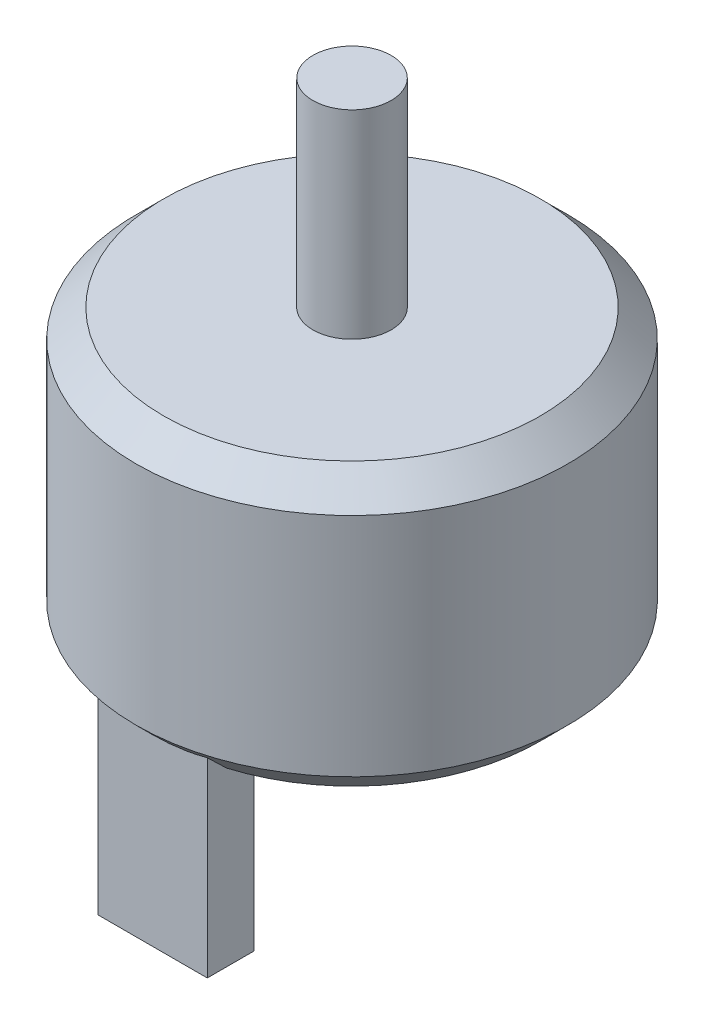
ISO-10303-21;
HEADER;
FILE_DESCRIPTION(('STEP AP214'),'2;1');
FILE_NAME('part.step','',(''),(''),'','','');
FILE_SCHEMA(('AUTOMOTIVE_DESIGN { 1 0 10303 214 1 1 1 1 }'));
ENDSEC;
DATA;
#1=APPLICATION_CONTEXT('core data for automotive mechanical design processes');
#2=APPLICATION_PROTOCOL_DEFINITION('international standard','automotive_design',2000,#1);
#3=PRODUCT_CONTEXT('',#1,'mechanical');
#4=PRODUCT('Part','Part','',(#3));
#5=PRODUCT_RELATED_PRODUCT_CATEGORY('part','',(#4));
#6=PRODUCT_DEFINITION_FORMATION('','',#4);
#7=PRODUCT_DEFINITION_CONTEXT('part definition',#1,'design');
#8=PRODUCT_DEFINITION('design','',#6,#7);
#9=PRODUCT_DEFINITION_SHAPE('','',#8);
#10=(LENGTH_UNIT() NAMED_UNIT(*) SI_UNIT(.MILLI.,.METRE.));
#11=(NAMED_UNIT(*) PLANE_ANGLE_UNIT() SI_UNIT($,.RADIAN.));
#12=(NAMED_UNIT(*) SI_UNIT($,.STERADIAN.) SOLID_ANGLE_UNIT());
#13=UNCERTAINTY_MEASURE_WITH_UNIT(LENGTH_MEASURE(1.E-05),#10,'distance_accuracy_value','');
#14=(GEOMETRIC_REPRESENTATION_CONTEXT(3) GLOBAL_UNCERTAINTY_ASSIGNED_CONTEXT((#13)) GLOBAL_UNIT_ASSIGNED_CONTEXT((#10,
#11,#12)) REPRESENTATION_CONTEXT('',''));
#15=CARTESIAN_POINT('',(0.,0.,0.));
#16=DIRECTION('',(0.,0.,1.));
#17=DIRECTION('',(1.,0.,0.));
#18=AXIS2_PLACEMENT_3D('',#15,#16,#17);
#19=CARTESIAN_POINT('',(0.,0.,0.));
#20=DIRECTION('',(0.,1.,0.));
#21=DIRECTION('',(0.,0.,1.));
#22=AXIS2_PLACEMENT_3D('',#19,#20,#21);
#23=PLANE('',#22);
#24=DIRECTION('',(0.,0.,1.));
#25=VECTOR('',#24,1.);
#26=CARTESIAN_POINT('',(3.5,0.,0.));
#27=LINE('',#26,#25);
#28=CARTESIAN_POINT('',(3.5,0.,9.75));
#29=VERTEX_POINT('',#28);
#30=CARTESIAN_POINT('',(3.5,0.,11.5119343334701));
#31=VERTEX_POINT('',#30);
#32=EDGE_CURVE('E70',#29,#31,#27,.T.);
#33=ORIENTED_EDGE('',*,*,#32,.F.);
#34=DIRECTION('',(-1.,0.,0.));
#35=VECTOR('',#34,1.);
#36=CARTESIAN_POINT('',(0.,0.,9.75));
#37=LINE('',#36,#35);
#38=CARTESIAN_POINT('',(-3.5,0.,9.75));
#39=VERTEX_POINT('',#38);
#40=EDGE_CURVE('E11',#29,#39,#37,.T.);
#41=ORIENTED_EDGE('',*,*,#40,.T.);
#42=DIRECTION('',(0.,0.,1.));
#43=VECTOR('',#42,1.);
#44=CARTESIAN_POINT('',(-3.5,0.,0.));
#45=LINE('',#44,#43);
#46=CARTESIAN_POINT('',(-3.5,0.,11.5119343334701));
#47=VERTEX_POINT('',#46);
#48=EDGE_CURVE('E125',#39,#47,#45,.T.);
#49=ORIENTED_EDGE('',*,*,#48,.T.);
#50=CARTESIAN_POINT('',(0.,0.,0.));
#51=DIRECTION('',(0.,1.,0.));
#52=DIRECTION('',(0.,0.,1.));
#53=AXIS2_PLACEMENT_3D('',#50,#51,#52);
#54=CIRCLE('',#53,12.0322330470336);
#55=EDGE_CURVE('E140',#31,#47,#54,.T.);
#56=ORIENTED_EDGE('',*,*,#55,.F.);
#57=EDGE_LOOP('',(#33,#41,#49,#56));
#58=FACE_BOUND('',#57,.T.);
#59=ADVANCED_FACE('F47',(#58),#23,.F.);
#60=CARTESIAN_POINT('',(0.,1.76776695296637,0.));
#61=DIRECTION('',(0.,1.,0.));
#62=DIRECTION('',(0.,0.,1.));
#63=AXIS2_PLACEMENT_3D('',#60,#61,#62);
#64=CONICAL_SURFACE('',#63,13.8,0.785398163397448);
#65=CARTESIAN_POINT('',(0.,1.76776695296637,0.));
#66=DIRECTION('',(0.,1.,0.));
#67=DIRECTION('',(0.,0.,1.));
#68=AXIS2_PLACEMENT_3D('',#65,#66,#67);
#69=CIRCLE('',#68,13.8);
#70=CARTESIAN_POINT('',(0.,1.76776695296637,13.8));
#71=VERTEX_POINT('',#70);
#72=EDGE_CURVE('E151',#71,#71,#69,.T.);
#73=ORIENTED_EDGE('',*,*,#72,.F.);
#74=EDGE_LOOP('',(#73));
#75=FACE_BOUND('',#74,.T.);
#76=CARTESIAN_POINT('',(-10.7199645390968,4.62550208471502,12.75));
#77=CARTESIAN_POINT('',(-10.4615046182126,4.45919940565822,12.75));
#78=CARTESIAN_POINT('',(-10.2014478800565,4.29534005723114,12.75));
#79=CARTESIAN_POINT('',(-9.67773660900564,3.97333436747692,12.75));
#80=CARTESIAN_POINT('',(-9.41408120385057,3.81518944637563,12.75));
#81=CARTESIAN_POINT('',(-8.88165621301418,3.50479932443179,12.75));
#82=CARTESIAN_POINT('',(-8.61286850241063,3.35258510126118,12.75));
#83=CARTESIAN_POINT('',(-8.07104771240983,3.05593783204122,12.75));
#84=CARTESIAN_POINT('',(-7.79801490285499,2.91150429399239,12.75));
#85=CARTESIAN_POINT('',(-7.24029444387663,2.62809541385545,12.75));
#86=CARTESIAN_POINT('',(-6.95548721500776,2.48935362050339,12.75));
#87=CARTESIAN_POINT('',(-6.38072617060722,2.22298670069006,12.75));
#88=CARTESIAN_POINT('',(-6.09077188612631,2.09536259348626,12.75));
#89=CARTESIAN_POINT('',(-5.21377772279077,1.73232945831018,12.75));
#90=CARTESIAN_POINT('',(-4.61840692812247,1.51613371727252,12.75));
#91=CARTESIAN_POINT('',(-3.63727076525292,1.22159920488261,12.75));
#92=CARTESIAN_POINT('',(-3.25782941917813,1.1220937268612,12.75));
#93=CARTESIAN_POINT('',(-2.49207911408716,0.953666806443665,12.75));
#94=CARTESIAN_POINT('',(-2.10577001601473,0.884745984052044,12.75));
#95=CARTESIAN_POINT('',(-1.33282557534581,0.781585026680928,12.75));
#96=CARTESIAN_POINT('',(-0.946240806207345,0.746970837637973,12.75));
#97=CARTESIAN_POINT('',(-0.171521109571769,0.713049188343842,12.75));
#98=CARTESIAN_POINT('',(0.216613715663704,0.713739436212732,12.75));
#99=CARTESIAN_POINT('',(0.991264142745009,0.75038567439744,12.75));
#100=CARTESIAN_POINT('',(1.37777940455846,0.786348730995671,12.75));
#101=CARTESIAN_POINT('',(2.14622762345694,0.891535990360127,12.75));
#102=CARTESIAN_POINT('',(2.52816006273178,0.960763916097625,12.75));
#103=CARTESIAN_POINT('',(3.28937475217692,1.12995481297037,12.75));
#104=CARTESIAN_POINT('',(3.66858444818363,1.23023999059712,12.75));
#105=CARTESIAN_POINT('',(4.41895574010181,1.45708462721936,12.75));
#106=CARTESIAN_POINT('',(4.79011731137796,1.58364416662817,12.75));
#107=CARTESIAN_POINT('',(5.65361895513471,1.90741757858732,12.75));
#108=CARTESIAN_POINT('',(6.1425022434067,2.1138042651344,12.75));
#109=CARTESIAN_POINT('',(7.10601699204353,2.5580004770507,12.75));
#110=CARTESIAN_POINT('',(7.58063703232281,2.795834399559,12.75));
#111=CARTESIAN_POINT('',(8.27719452972378,3.16767734405835,12.75));
#112=CARTESIAN_POINT('',(8.50410633685245,3.29250975402958,12.75));
#113=CARTESIAN_POINT('',(8.9550645882295,3.54727384977366,12.75));
#114=CARTESIAN_POINT('',(9.17911093798644,3.67720570313406,12.75));
#115=CARTESIAN_POINT('',(9.62405273138199,3.94127257204673,12.75));
#116=CARTESIAN_POINT('',(9.84495391492738,4.07539794776756,12.75));
#117=CARTESIAN_POINT('',(10.2842677869396,4.34760379251452,12.75));
#118=CARTESIAN_POINT('',(10.5026807967863,4.48568374247131,12.75));
#119=CARTESIAN_POINT('',(10.7199645390968,4.62550208471502,12.75));
#120=B_SPLINE_CURVE_WITH_KNOTS('',3,(#76,#77,#78,#79,#80,#81,#82,#83,#84,#85,#86,#87,#88,#89,
#90,#91,#92,#93,#94,#95,#96,#97,#98,#99,#100,#101,#102,#103,#104,#105,#106,#107,#108,#109,#110,
#111,#112,#113,#114,#115,#116,#117,#118,#119),.UNSPECIFIED.,.F.,.F.,(4,2,2,2,2,2,2,2,2,2,2,2,2,
2,2,2,2,2,2,2,2,4),(0.,0.922037904637879,1.84430341199032,2.77087302499729,3.69738397888199,
4.64755323139292,5.59780950291928,7.49427381181654,8.67006183943126,9.84587370123856,
11.0087195121989,12.1714898340754,13.3344931439773,14.4976266463877,15.6732560752065,
16.8488891021215,18.4393763459261,20.0311048289955,20.8080024914036,21.584925707106,
22.3601781426167,23.1353292822745),.UNSPECIFIED.);
#121=CARTESIAN_POINT('',(-3.5,1.18943477514372,12.75));
#122=VERTEX_POINT('',#121);
#123=CARTESIAN_POINT('',(3.5,1.18943477514372,12.75));
#124=VERTEX_POINT('',#123);
#125=EDGE_CURVE('E145',#122,#124,#120,.T.);
#126=ORIENTED_EDGE('',*,*,#125,.T.);
#127=CARTESIAN_POINT('',(3.5,4.57311151867401,16.232297069296));
#128=CARTESIAN_POINT('',(3.5,4.23345547727206,15.8848314102714));
#129=CARTESIAN_POINT('',(3.5,3.89404221905712,15.5371287934946));
#130=CARTESIAN_POINT('',(3.5,3.21582142130345,14.8411337373187));
#131=CARTESIAN_POINT('',(3.5,2.8770138814437,14.4928412982324));
#132=CARTESIAN_POINT('',(3.5,1.86171985858152,13.4469463805114));
#133=CARTESIAN_POINT('',(3.5,1.18632146856986,12.7482849233056));
#134=CARTESIAN_POINT('',(3.5,0.176707846062136,11.6969071581238));
#135=CARTESIAN_POINT('',(3.5,-0.159259052281474,11.345873419122));
#136=CARTESIAN_POINT('',(3.5,-0.829647859652654,10.6423377762183));
#137=CARTESIAN_POINT('',(3.5,-1.16406978019819,10.2898358832989));
#138=CARTESIAN_POINT('',(3.5,-1.83088091330642,9.5828710088045));
#139=CARTESIAN_POINT('',(3.5,-2.16327000129742,9.22840790953262));
#140=CARTESIAN_POINT('',(3.5,-2.6597227432831,8.6947221908894));
#141=CARTESIAN_POINT('',(3.5,-2.82485391532166,8.51649284179823));
#142=CARTESIAN_POINT('',(3.5,-3.15425720212487,8.15923996459964));
#143=CARTESIAN_POINT('',(3.5,-3.31852931088919,7.98021643096118));
#144=CARTESIAN_POINT('',(3.5,-3.48229706929602,7.80073106980442));
#145=B_SPLINE_CURVE_WITH_KNOTS('',3,(#127,#128,#129,#130,#131,#132,#133,#134,#135,#136,#137,
#138,#139,#140,#141,#142,#143,#144),.UNSPECIFIED.,.F.,.F.,(4,2,2,2,2,2,2,2,4),(0.,
1.45769858623785,2.91539639970073,5.83061831986172,7.28831375960544,8.74599831448556,
10.2037713185743,10.9326762409336,11.6615862477099),.UNSPECIFIED.);
#146=EDGE_CURVE('E56',#124,#31,#145,.T.);
#147=ORIENTED_EDGE('',*,*,#146,.T.);
#148=ORIENTED_EDGE('',*,*,#55,.T.);
#149=CARTESIAN_POINT('',(-3.5,4.57311151867401,16.232297069296));
#150=CARTESIAN_POINT('',(-3.5,4.23345547727206,15.8848314102714));
#151=CARTESIAN_POINT('',(-3.5,3.89404221905712,15.5371287934946));
#152=CARTESIAN_POINT('',(-3.5,3.21582142130345,14.8411337373187));
#153=CARTESIAN_POINT('',(-3.5,2.8770138814437,14.4928412982324));
#154=CARTESIAN_POINT('',(-3.5,1.86171985858152,13.4469463805114));
#155=CARTESIAN_POINT('',(-3.5,1.18632146856985,12.7482849233056));
#156=CARTESIAN_POINT('',(-3.5,0.176707846062132,11.6969071581238));
#157=CARTESIAN_POINT('',(-3.5,-0.159259052281479,11.345873419122));
#158=CARTESIAN_POINT('',(-3.5,-0.829647859652659,10.6423377762183));
#159=CARTESIAN_POINT('',(-3.5,-1.1640697801982,10.2898358832989));
#160=CARTESIAN_POINT('',(-3.5,-1.83088091330642,9.58287100880449));
#161=CARTESIAN_POINT('',(-3.5,-2.16327000129743,9.22840790953261));
#162=CARTESIAN_POINT('',(-3.5,-2.65972274328311,8.6947221908894));
#163=CARTESIAN_POINT('',(-3.5,-2.82485391532167,8.51649284179822));
#164=CARTESIAN_POINT('',(-3.5,-3.15425720212487,8.15923996459963));
#165=CARTESIAN_POINT('',(-3.5,-3.3185293108892,7.98021643096117));
#166=CARTESIAN_POINT('',(-3.5,-3.48229706929603,7.80073106980441));
#167=B_SPLINE_CURVE_WITH_KNOTS('',3,(#149,#150,#151,#152,#153,#154,#155,#156,#157,#158,#159,
#160,#161,#162,#163,#164,#165,#166),.UNSPECIFIED.,.F.,.F.,(4,2,2,2,2,2,2,2,4),(0.,
1.45769858623785,2.91539639970073,5.83061831986173,7.28831375960545,8.74599831448557,
10.2037713185743,10.9326762409336,11.6615862477099),.UNSPECIFIED.);
#168=EDGE_CURVE('E169',#122,#47,#167,.T.);
#169=ORIENTED_EDGE('',*,*,#168,.F.);
#170=EDGE_LOOP('',(#126,#147,#148,#169));
#171=FACE_BOUND('',#170,.T.);
#172=ADVANCED_FACE('F175',(#75,#171),#64,.T.);
#173=CARTESIAN_POINT('',(0.,18.,0.));
#174=DIRECTION('',(0.,-1.,0.));
#175=DIRECTION('',(0.,0.,-1.));
#176=AXIS2_PLACEMENT_3D('',#173,#174,#175);
#177=CYLINDRICAL_SURFACE('',#176,13.8);
#178=ORIENTED_EDGE('',*,*,#72,.T.);
#179=EDGE_LOOP('',(#178));
#180=FACE_BOUND('',#179,.T.);
#181=CARTESIAN_POINT('',(0.,16.2322330470336,0.));
#182=DIRECTION('',(0.,1.,0.));
#183=DIRECTION('',(0.,0.,1.));
#184=AXIS2_PLACEMENT_3D('',#181,#182,#183);
#185=CIRCLE('',#184,13.8);
#186=CARTESIAN_POINT('',(0.,16.2322330470336,13.8));
#187=VERTEX_POINT('',#186);
#188=EDGE_CURVE('E146',#187,#187,#185,.T.);
#189=ORIENTED_EDGE('',*,*,#188,.F.);
#190=EDGE_LOOP('',(#189));
#191=FACE_BOUND('',#190,.T.);
#192=ADVANCED_FACE('F49',(#180,#191),#177,.T.);
#193=CARTESIAN_POINT('',(0.,18.,0.));
#194=DIRECTION('',(0.,-1.,0.));
#195=DIRECTION('',(0.,0.,-1.));
#196=AXIS2_PLACEMENT_3D('',#193,#194,#195);
#197=CONICAL_SURFACE('',#196,12.0322330470336,0.785398163397448);
#198=ORIENTED_EDGE('',*,*,#188,.T.);
#199=EDGE_LOOP('',(#198));
#200=FACE_BOUND('',#199,.T.);
#201=CARTESIAN_POINT('',(0.,18.,0.));
#202=DIRECTION('',(0.,1.,0.));
#203=DIRECTION('',(0.,0.,1.));
#204=AXIS2_PLACEMENT_3D('',#201,#202,#203);
#205=CIRCLE('',#204,12.0322330470336);
#206=CARTESIAN_POINT('',(0.,18.,12.0322330470336));
#207=VERTEX_POINT('',#206);
#208=EDGE_CURVE('E147',#207,#207,#205,.T.);
#209=ORIENTED_EDGE('',*,*,#208,.F.);
#210=EDGE_LOOP('',(#209));
#211=FACE_BOUND('',#210,.T.);
#212=ADVANCED_FACE('F209',(#200,#211),#197,.T.);
#213=CARTESIAN_POINT('',(0.,18.,0.));
#214=DIRECTION('',(0.,1.,0.));
#215=DIRECTION('',(0.,0.,1.));
#216=AXIS2_PLACEMENT_3D('',#213,#214,#215);
#217=PLANE('',#216);
#218=CARTESIAN_POINT('',(0.,18.,0.));
#219=DIRECTION('',(0.,1.,0.));
#220=DIRECTION('',(0.,0.,1.));
#221=AXIS2_PLACEMENT_3D('',#218,#219,#220);
#222=CIRCLE('',#221,2.5);
#223=CARTESIAN_POINT('',(0.,18.,2.5));
#224=VERTEX_POINT('',#223);
#225=EDGE_CURVE('E141',#224,#224,#222,.T.);
#226=ORIENTED_EDGE('',*,*,#225,.F.);
#227=EDGE_LOOP('',(#226));
#228=FACE_BOUND('',#227,.T.);
#229=ORIENTED_EDGE('',*,*,#208,.T.);
#230=EDGE_LOOP('',(#229));
#231=FACE_BOUND('',#230,.T.);
#232=ADVANCED_FACE('F217',(#228,#231),#217,.T.);
#233=CARTESIAN_POINT('',(0.,30.7,0.));
#234=DIRECTION('',(0.,-1.,0.));
#235=DIRECTION('',(0.,0.,-1.));
#236=AXIS2_PLACEMENT_3D('',#233,#234,#235);
#237=CYLINDRICAL_SURFACE('',#236,2.5);
#238=CARTESIAN_POINT('',(0.,30.7,0.));
#239=DIRECTION('',(0.,1.,0.));
#240=DIRECTION('',(0.,0.,1.));
#241=AXIS2_PLACEMENT_3D('',#238,#239,#240);
#242=CIRCLE('',#241,2.5);
#243=CARTESIAN_POINT('',(0.,30.7,2.5));
#244=VERTEX_POINT('',#243);
#245=EDGE_CURVE('E136',#244,#244,#242,.T.);
#246=ORIENTED_EDGE('',*,*,#245,.F.);
#247=EDGE_LOOP('',(#246));
#248=FACE_BOUND('',#247,.T.);
#249=ORIENTED_EDGE('',*,*,#225,.T.);
#250=EDGE_LOOP('',(#249));
#251=FACE_BOUND('',#250,.T.);
#252=ADVANCED_FACE('F221',(#248,#251),#237,.T.);
#253=CARTESIAN_POINT('',(0.,30.7,0.));
#254=DIRECTION('',(0.,1.,0.));
#255=DIRECTION('',(0.,0.,1.));
#256=AXIS2_PLACEMENT_3D('',#253,#254,#255);
#257=PLANE('',#256);
#258=ORIENTED_EDGE('',*,*,#245,.T.);
#259=EDGE_LOOP('',(#258));
#260=FACE_BOUND('',#259,.T.);
#261=ADVANCED_FACE('F189',(#260),#257,.T.);
#262=CARTESIAN_POINT('',(0.,3.,9.75));
#263=DIRECTION('',(0.,0.,-1.));
#264=DIRECTION('',(-1.,0.,0.));
#265=AXIS2_PLACEMENT_3D('',#262,#263,#264);
#266=PLANE('',#265);
#267=ORIENTED_EDGE('',*,*,#40,.F.);
#268=DIRECTION('',(0.,-1.,0.));
#269=VECTOR('',#268,1.);
#270=CARTESIAN_POINT('',(3.5,3.,9.75));
#271=LINE('',#270,#269);
#272=CARTESIAN_POINT('',(3.5,-11.,9.75));
#273=VERTEX_POINT('',#272);
#274=EDGE_CURVE('E122',#29,#273,#271,.T.);
#275=ORIENTED_EDGE('',*,*,#274,.T.);
#276=DIRECTION('',(1.,0.,0.));
#277=VECTOR('',#276,1.);
#278=CARTESIAN_POINT('',(0.,-11.,9.75));
#279=LINE('',#278,#277);
#280=CARTESIAN_POINT('',(-3.5,-11.,9.75));
#281=VERTEX_POINT('',#280);
#282=EDGE_CURVE('E100',#281,#273,#279,.T.);
#283=ORIENTED_EDGE('',*,*,#282,.F.);
#284=DIRECTION('',(0.,-1.,0.));
#285=VECTOR('',#284,1.);
#286=CARTESIAN_POINT('',(-3.5,3.,9.75));
#287=LINE('',#286,#285);
#288=EDGE_CURVE('E126',#39,#281,#287,.T.);
#289=ORIENTED_EDGE('',*,*,#288,.F.);
#290=EDGE_LOOP('',(#267,#275,#283,#289));
#291=FACE_BOUND('',#290,.T.);
#292=ADVANCED_FACE('F188',(#291),#266,.T.);
#293=CARTESIAN_POINT('',(3.5,3.,0.));
#294=DIRECTION('',(-1.,0.,0.));
#295=DIRECTION('',(0.,0.,1.));
#296=AXIS2_PLACEMENT_3D('',#293,#294,#295);
#297=PLANE('',#296);
#298=ORIENTED_EDGE('',*,*,#274,.F.);
#299=ORIENTED_EDGE('',*,*,#32,.T.);
#300=ORIENTED_EDGE('',*,*,#146,.F.);
#301=DIRECTION('',(0.,-1.,0.));
#302=VECTOR('',#301,1.);
#303=CARTESIAN_POINT('',(3.5,3.,12.75));
#304=LINE('',#303,#302);
#305=CARTESIAN_POINT('',(3.5,-11.,12.75));
#306=VERTEX_POINT('',#305);
#307=EDGE_CURVE('E63',#124,#306,#304,.T.);
#308=ORIENTED_EDGE('',*,*,#307,.T.);
#309=DIRECTION('',(0.,0.,-1.));
#310=VECTOR('',#309,1.);
#311=CARTESIAN_POINT('',(3.5,-11.,0.));
#312=LINE('',#311,#310);
#313=EDGE_CURVE('E96',#306,#273,#312,.T.);
#314=ORIENTED_EDGE('',*,*,#313,.T.);
#315=EDGE_LOOP('',(#298,#299,#300,#308,#314));
#316=FACE_BOUND('',#315,.T.);
#317=ADVANCED_FACE('F95',(#316),#297,.F.);
#318=CARTESIAN_POINT('',(-3.5,3.,0.));
#319=DIRECTION('',(-1.,0.,0.));
#320=DIRECTION('',(0.,0.,1.));
#321=AXIS2_PLACEMENT_3D('',#318,#319,#320);
#322=PLANE('',#321);
#323=ORIENTED_EDGE('',*,*,#48,.F.);
#324=ORIENTED_EDGE('',*,*,#288,.T.);
#325=DIRECTION('',(0.,0.,-1.));
#326=VECTOR('',#325,1.);
#327=CARTESIAN_POINT('',(-3.5,-11.,0.));
#328=LINE('',#327,#326);
#329=CARTESIAN_POINT('',(-3.5,-11.,12.75));
#330=VERTEX_POINT('',#329);
#331=EDGE_CURVE('E115',#330,#281,#328,.T.);
#332=ORIENTED_EDGE('',*,*,#331,.F.);
#333=DIRECTION('',(0.,-1.,0.));
#334=VECTOR('',#333,1.);
#335=CARTESIAN_POINT('',(-3.5,3.,12.75));
#336=LINE('',#335,#334);
#337=EDGE_CURVE('E99',#122,#330,#336,.T.);
#338=ORIENTED_EDGE('',*,*,#337,.F.);
#339=ORIENTED_EDGE('',*,*,#168,.T.);
#340=EDGE_LOOP('',(#323,#324,#332,#338,#339));
#341=FACE_BOUND('',#340,.T.);
#342=ADVANCED_FACE('F182',(#341),#322,.T.);
#343=CARTESIAN_POINT('',(0.,3.,12.75));
#344=DIRECTION('',(0.,0.,-1.));
#345=DIRECTION('',(-1.,0.,0.));
#346=AXIS2_PLACEMENT_3D('',#343,#344,#345);
#347=PLANE('',#346);
#348=ORIENTED_EDGE('',*,*,#125,.F.);
#349=ORIENTED_EDGE('',*,*,#337,.T.);
#350=DIRECTION('',(1.,0.,0.));
#351=VECTOR('',#350,1.);
#352=CARTESIAN_POINT('',(0.,-11.,12.75));
#353=LINE('',#352,#351);
#354=EDGE_CURVE('E107',#330,#306,#353,.T.);
#355=ORIENTED_EDGE('',*,*,#354,.T.);
#356=ORIENTED_EDGE('',*,*,#307,.F.);
#357=EDGE_LOOP('',(#348,#349,#355,#356));
#358=FACE_BOUND('',#357,.T.);
#359=ADVANCED_FACE('F111',(#358),#347,.F.);
#360=CARTESIAN_POINT('',(0.,-11.,0.));
#361=DIRECTION('',(0.,-1.,0.));
#362=DIRECTION('',(0.,0.,-1.));
#363=AXIS2_PLACEMENT_3D('',#360,#361,#362);
#364=PLANE('',#363);
#365=ORIENTED_EDGE('',*,*,#313,.F.);
#366=ORIENTED_EDGE('',*,*,#354,.F.);
#367=ORIENTED_EDGE('',*,*,#331,.T.);
#368=ORIENTED_EDGE('',*,*,#282,.T.);
#369=EDGE_LOOP('',(#365,#366,#367,#368));
#370=FACE_BOUND('',#369,.T.);
#371=ADVANCED_FACE('F105',(#370),#364,.T.);
#372=CLOSED_SHELL('',(#59,#172,#192,#212,#232,#252,#261,#292,#317,#342,#359,#371));
#373=MANIFOLD_SOLID_BREP('B2',#372);
#374=ADVANCED_BREP_SHAPE_REPRESENTATION('',(#18,#373),#14);
#375=SHAPE_DEFINITION_REPRESENTATION(#9,#374);
ENDSEC;
END-ISO-10303-21;
